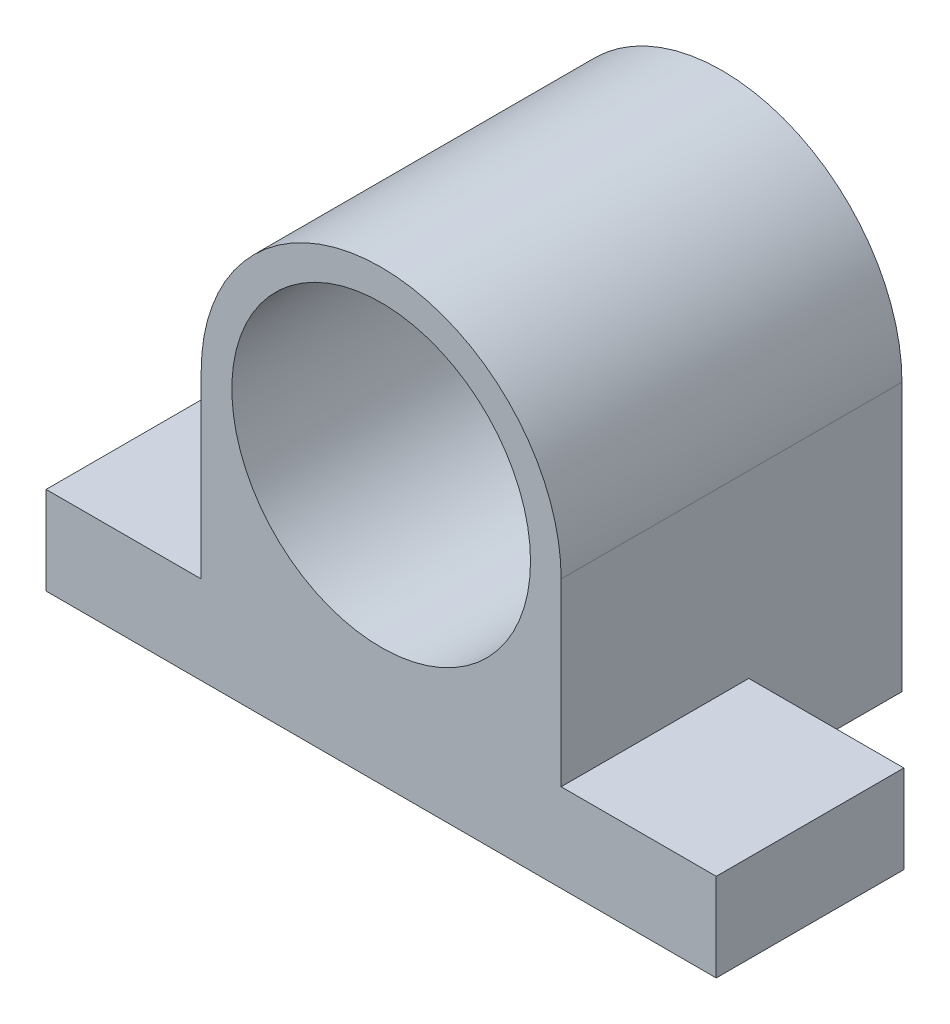
ISO-10303-21;
HEADER;
FILE_DESCRIPTION(('STEP AP214'),'2;1');
FILE_NAME('part.step','',(''),(''),'','','');
FILE_SCHEMA(('AUTOMOTIVE_DESIGN { 1 0 10303 214 1 1 1 1 }'));
ENDSEC;
DATA;
#1=APPLICATION_CONTEXT('core data for automotive mechanical design processes');
#2=APPLICATION_PROTOCOL_DEFINITION('international standard','automotive_design',2000,#1);
#3=PRODUCT_CONTEXT('',#1,'mechanical');
#4=PRODUCT('Part','Part','',(#3));
#5=PRODUCT_RELATED_PRODUCT_CATEGORY('part','',(#4));
#6=PRODUCT_DEFINITION_FORMATION('','',#4);
#7=PRODUCT_DEFINITION_CONTEXT('part definition',#1,'design');
#8=PRODUCT_DEFINITION('design','',#6,#7);
#9=PRODUCT_DEFINITION_SHAPE('','',#8);
#10=(LENGTH_UNIT() NAMED_UNIT(*) SI_UNIT(.MILLI.,.METRE.));
#11=(NAMED_UNIT(*) PLANE_ANGLE_UNIT() SI_UNIT($,.RADIAN.));
#12=(NAMED_UNIT(*) SI_UNIT($,.STERADIAN.) SOLID_ANGLE_UNIT());
#13=UNCERTAINTY_MEASURE_WITH_UNIT(LENGTH_MEASURE(1.E-05),#10,'distance_accuracy_value','');
#14=(GEOMETRIC_REPRESENTATION_CONTEXT(3) GLOBAL_UNCERTAINTY_ASSIGNED_CONTEXT((#13)) GLOBAL_UNIT_ASSIGNED_CONTEXT((#10,
#11,#12)) REPRESENTATION_CONTEXT('',''));
#15=CARTESIAN_POINT('',(0.,0.,0.));
#16=DIRECTION('',(0.,0.,1.));
#17=DIRECTION('',(1.,0.,0.));
#18=AXIS2_PLACEMENT_3D('',#15,#16,#17);
#19=CARTESIAN_POINT('',(0.,0.,0.));
#20=DIRECTION('',(0.,0.,1.));
#21=DIRECTION('',(1.,0.,0.));
#22=AXIS2_PLACEMENT_3D('',#19,#20,#21);
#23=PLANE('',#22);
#24=DIRECTION('',(0.,1.,0.));
#25=VECTOR('',#24,1.);
#26=CARTESIAN_POINT('',(11.938,0.,0.));
#27=LINE('',#26,#25);
#28=CARTESIAN_POINT('',(11.938,-17.78,0.));
#29=VERTEX_POINT('',#28);
#30=CARTESIAN_POINT('',(11.938,0.,0.));
#31=VERTEX_POINT('',#30);
#32=EDGE_CURVE('E62',#29,#31,#27,.T.);
#33=ORIENTED_EDGE('',*,*,#32,.F.);
#34=DIRECTION('',(1.,0.,0.));
#35=VECTOR('',#34,1.);
#36=CARTESIAN_POINT('',(22.225,-17.78,0.));
#37=LINE('',#36,#35);
#38=CARTESIAN_POINT('',(-11.938,-17.78,0.));
#39=VERTEX_POINT('',#38);
#40=EDGE_CURVE('E255',#39,#29,#37,.T.);
#41=ORIENTED_EDGE('',*,*,#40,.F.);
#42=DIRECTION('',(0.,-1.,0.));
#43=VECTOR('',#42,1.);
#44=CARTESIAN_POINT('',(-11.938,-11.938,0.));
#45=LINE('',#44,#43);
#46=CARTESIAN_POINT('',(-11.938,0.,0.));
#47=VERTEX_POINT('',#46);
#48=EDGE_CURVE('E252',#47,#39,#45,.T.);
#49=ORIENTED_EDGE('',*,*,#48,.F.);
#50=CARTESIAN_POINT('',(0.,0.,0.));
#51=DIRECTION('',(0.,0.,1.));
#52=DIRECTION('',(1.,0.,0.));
#53=AXIS2_PLACEMENT_3D('',#50,#51,#52);
#54=CIRCLE('',#53,11.938);
#55=EDGE_CURVE('E248',#31,#47,#54,.T.);
#56=ORIENTED_EDGE('',*,*,#55,.F.);
#57=EDGE_LOOP('',(#33,#41,#49,#56));
#58=FACE_BOUND('',#57,.T.);
#59=CARTESIAN_POINT('',(0.,0.,0.));
#60=DIRECTION('',(0.,0.,1.));
#61=DIRECTION('',(1.,0.,0.));
#62=AXIS2_PLACEMENT_3D('',#59,#60,#61);
#63=CIRCLE('',#62,8.763);
#64=CARTESIAN_POINT('',(8.763,0.,0.));
#65=VERTEX_POINT('',#64);
#66=EDGE_CURVE('E244',#65,#65,#63,.T.);
#67=ORIENTED_EDGE('',*,*,#66,.T.);
#68=EDGE_LOOP('',(#67));
#69=FACE_BOUND('',#68,.T.);
#70=ADVANCED_FACE('F38',(#58,#69),#23,.F.);
#71=CARTESIAN_POINT('',(0.,0.,3.556));
#72=DIRECTION('',(0.,0.,-1.));
#73=DIRECTION('',(-1.,0.,0.));
#74=AXIS2_PLACEMENT_3D('',#71,#72,#73);
#75=CYLINDRICAL_SURFACE('',#74,11.938);
#76=ORIENTED_EDGE('',*,*,#55,.T.);
#77=DIRECTION('',(0.,0.,-1.));
#78=VECTOR('',#77,1.);
#79=CARTESIAN_POINT('',(-11.938,0.,3.556));
#80=LINE('',#79,#78);
#81=CARTESIAN_POINT('',(-11.938,0.,22.606));
#82=VERTEX_POINT('',#81);
#83=EDGE_CURVE('E165',#82,#47,#80,.T.);
#84=ORIENTED_EDGE('',*,*,#83,.F.);
#85=CARTESIAN_POINT('',(0.,0.,22.606));
#86=DIRECTION('',(0.,0.,1.));
#87=DIRECTION('',(1.,0.,0.));
#88=AXIS2_PLACEMENT_3D('',#85,#86,#87);
#89=CIRCLE('',#88,11.938);
#90=CARTESIAN_POINT('',(11.938,0.,22.606));
#91=VERTEX_POINT('',#90);
#92=EDGE_CURVE('E209',#91,#82,#89,.T.);
#93=ORIENTED_EDGE('',*,*,#92,.F.);
#94=DIRECTION('',(0.,0.,-1.));
#95=VECTOR('',#94,1.);
#96=CARTESIAN_POINT('',(11.938,0.,3.556));
#97=LINE('',#96,#95);
#98=EDGE_CURVE('E141',#91,#31,#97,.T.);
#99=ORIENTED_EDGE('',*,*,#98,.T.);
#100=EDGE_LOOP('',(#76,#84,#93,#99));
#101=FACE_BOUND('',#100,.T.);
#102=ADVANCED_FACE('F40',(#101),#75,.T.);
#103=CARTESIAN_POINT('',(-11.938,-11.938,3.556));
#104=DIRECTION('',(1.,0.,0.));
#105=DIRECTION('',(0.,0.,-1.));
#106=AXIS2_PLACEMENT_3D('',#103,#104,#105);
#107=PLANE('',#106);
#108=ORIENTED_EDGE('',*,*,#48,.T.);
#109=DIRECTION('',(0.,0.,-1.));
#110=VECTOR('',#109,1.);
#111=CARTESIAN_POINT('',(-11.938,-17.78,3.556));
#112=LINE('',#111,#110);
#113=CARTESIAN_POINT('',(-11.938,-17.78,10.16));
#114=VERTEX_POINT('',#113);
#115=EDGE_CURVE('E11',#114,#39,#112,.T.);
#116=ORIENTED_EDGE('',*,*,#115,.F.);
#117=DIRECTION('',(0.,1.,0.));
#118=VECTOR('',#117,1.);
#119=CARTESIAN_POINT('',(-11.938,-24.638,10.16));
#120=LINE('',#119,#118);
#121=CARTESIAN_POINT('',(-11.938,-11.938,10.16));
#122=VERTEX_POINT('',#121);
#123=EDGE_CURVE('E54',#114,#122,#120,.T.);
#124=ORIENTED_EDGE('',*,*,#123,.T.);
#125=DIRECTION('',(0.,0.,-1.));
#126=VECTOR('',#125,1.);
#127=CARTESIAN_POINT('',(-11.938,-11.938,3.556));
#128=LINE('',#127,#126);
#129=CARTESIAN_POINT('',(-11.938,-11.938,22.606));
#130=VERTEX_POINT('',#129);
#131=EDGE_CURVE('E161',#130,#122,#128,.T.);
#132=ORIENTED_EDGE('',*,*,#131,.F.);
#133=DIRECTION('',(0.,-1.,0.));
#134=VECTOR('',#133,1.);
#135=CARTESIAN_POINT('',(-11.938,0.,22.606));
#136=LINE('',#135,#134);
#137=EDGE_CURVE('E216',#82,#130,#136,.T.);
#138=ORIENTED_EDGE('',*,*,#137,.F.);
#139=ORIENTED_EDGE('',*,*,#83,.T.);
#140=EDGE_LOOP('',(#108,#116,#124,#132,#138,#139));
#141=FACE_BOUND('',#140,.T.);
#142=ADVANCED_FACE('F275',(#141),#107,.F.);
#143=CARTESIAN_POINT('',(-22.225,-11.938,3.556));
#144=DIRECTION('',(0.,-1.,0.));
#145=DIRECTION('',(0.,0.,-1.));
#146=AXIS2_PLACEMENT_3D('',#143,#144,#145);
#147=PLANE('',#146);
#148=ORIENTED_EDGE('',*,*,#131,.T.);
#149=DIRECTION('',(1.,0.,0.));
#150=VECTOR('',#149,1.);
#151=CARTESIAN_POINT('',(-22.225,-11.938,10.16));
#152=LINE('',#151,#150);
#153=CARTESIAN_POINT('',(-22.225,-11.938,10.16));
#154=VERTEX_POINT('',#153);
#155=EDGE_CURVE('E190',#154,#122,#152,.T.);
#156=ORIENTED_EDGE('',*,*,#155,.F.);
#157=DIRECTION('',(0.,0.,-1.));
#158=VECTOR('',#157,1.);
#159=CARTESIAN_POINT('',(-22.225,-11.938,3.556));
#160=LINE('',#159,#158);
#161=CARTESIAN_POINT('',(-22.225,-11.938,22.606));
#162=VERTEX_POINT('',#161);
#163=EDGE_CURVE('E157',#162,#154,#160,.T.);
#164=ORIENTED_EDGE('',*,*,#163,.F.);
#165=DIRECTION('',(-1.,0.,0.));
#166=VECTOR('',#165,1.);
#167=CARTESIAN_POINT('',(-11.938,-11.938,22.606));
#168=LINE('',#167,#166);
#169=EDGE_CURVE('E220',#130,#162,#168,.T.);
#170=ORIENTED_EDGE('',*,*,#169,.F.);
#171=EDGE_LOOP('',(#148,#156,#164,#170));
#172=FACE_BOUND('',#171,.T.);
#173=ADVANCED_FACE('F273',(#172),#147,.F.);
#174=CARTESIAN_POINT('',(-22.225,-17.78,3.556));
#175=DIRECTION('',(1.,0.,0.));
#176=DIRECTION('',(0.,0.,-1.));
#177=AXIS2_PLACEMENT_3D('',#174,#175,#176);
#178=PLANE('',#177);
#179=ORIENTED_EDGE('',*,*,#163,.T.);
#180=DIRECTION('',(0.,1.,0.));
#181=VECTOR('',#180,1.);
#182=CARTESIAN_POINT('',(-22.225,-24.638,10.16));
#183=LINE('',#182,#181);
#184=CARTESIAN_POINT('',(-22.225,-17.78,10.16));
#185=VERTEX_POINT('',#184);
#186=EDGE_CURVE('E183',#185,#154,#183,.T.);
#187=ORIENTED_EDGE('',*,*,#186,.F.);
#188=DIRECTION('',(0.,0.,-1.));
#189=VECTOR('',#188,1.);
#190=CARTESIAN_POINT('',(-22.225,-17.78,3.556));
#191=LINE('',#190,#189);
#192=CARTESIAN_POINT('',(-22.225,-17.78,22.606));
#193=VERTEX_POINT('',#192);
#194=EDGE_CURVE('E153',#193,#185,#191,.T.);
#195=ORIENTED_EDGE('',*,*,#194,.F.);
#196=DIRECTION('',(0.,-1.,0.));
#197=VECTOR('',#196,1.);
#198=CARTESIAN_POINT('',(-22.225,-11.938,22.606));
#199=LINE('',#198,#197);
#200=EDGE_CURVE('E224',#162,#193,#199,.T.);
#201=ORIENTED_EDGE('',*,*,#200,.F.);
#202=EDGE_LOOP('',(#179,#187,#195,#201));
#203=FACE_BOUND('',#202,.T.);
#204=ADVANCED_FACE('F186',(#203),#178,.F.);
#205=CARTESIAN_POINT('',(22.225,-17.78,3.556));
#206=DIRECTION('',(0.,1.,0.));
#207=DIRECTION('',(-1.,0.,0.));
#208=AXIS2_PLACEMENT_3D('',#205,#206,#207);
#209=PLANE('',#208);
#210=ORIENTED_EDGE('',*,*,#40,.T.);
#211=DIRECTION('',(0.,0.,1.));
#212=VECTOR('',#211,1.);
#213=CARTESIAN_POINT('',(11.938,-17.78,3.556));
#214=LINE('',#213,#212);
#215=CARTESIAN_POINT('',(11.938,-17.78,10.16));
#216=VERTEX_POINT('',#215);
#217=EDGE_CURVE('E199',#29,#216,#214,.T.);
#218=ORIENTED_EDGE('',*,*,#217,.T.);
#219=DIRECTION('',(1.,0.,0.));
#220=VECTOR('',#219,1.);
#221=CARTESIAN_POINT('',(22.225,-17.78,10.16));
#222=LINE('',#221,#220);
#223=CARTESIAN_POINT('',(22.225,-17.78,10.16));
#224=VERTEX_POINT('',#223);
#225=EDGE_CURVE('E121',#216,#224,#222,.T.);
#226=ORIENTED_EDGE('',*,*,#225,.T.);
#227=DIRECTION('',(0.,0.,-1.));
#228=VECTOR('',#227,1.);
#229=CARTESIAN_POINT('',(22.225,-17.78,3.556));
#230=LINE('',#229,#228);
#231=CARTESIAN_POINT('',(22.225,-17.78,22.606));
#232=VERTEX_POINT('',#231);
#233=EDGE_CURVE('E145',#232,#224,#230,.T.);
#234=ORIENTED_EDGE('',*,*,#233,.F.);
#235=DIRECTION('',(1.,0.,0.));
#236=VECTOR('',#235,1.);
#237=CARTESIAN_POINT('',(-22.225,-17.78,22.606));
#238=LINE('',#237,#236);
#239=EDGE_CURVE('E227',#193,#232,#238,.T.);
#240=ORIENTED_EDGE('',*,*,#239,.F.);
#241=ORIENTED_EDGE('',*,*,#194,.T.);
#242=DIRECTION('',(1.,0.,0.));
#243=VECTOR('',#242,1.);
#244=CARTESIAN_POINT('',(22.225,-17.78,10.16));
#245=LINE('',#244,#243);
#246=EDGE_CURVE('E47',#185,#114,#245,.T.);
#247=ORIENTED_EDGE('',*,*,#246,.T.);
#248=ORIENTED_EDGE('',*,*,#115,.T.);
#249=EDGE_LOOP('',(#210,#218,#226,#234,#240,#241,#247,#248));
#250=FACE_BOUND('',#249,.T.);
#251=ADVANCED_FACE('F178',(#250),#209,.F.);
#252=CARTESIAN_POINT('',(22.225,-11.938,3.556));
#253=DIRECTION('',(-1.,0.,0.));
#254=DIRECTION('',(0.,-1.,0.));
#255=AXIS2_PLACEMENT_3D('',#252,#253,#254);
#256=PLANE('',#255);
#257=ORIENTED_EDGE('',*,*,#233,.T.);
#258=DIRECTION('',(0.,1.,0.));
#259=VECTOR('',#258,1.);
#260=CARTESIAN_POINT('',(22.225,-24.638,10.16));
#261=LINE('',#260,#259);
#262=CARTESIAN_POINT('',(22.225,-11.938,10.16));
#263=VERTEX_POINT('',#262);
#264=EDGE_CURVE('E125',#224,#263,#261,.T.);
#265=ORIENTED_EDGE('',*,*,#264,.T.);
#266=DIRECTION('',(0.,0.,-1.));
#267=VECTOR('',#266,1.);
#268=CARTESIAN_POINT('',(22.225,-11.938,3.556));
#269=LINE('',#268,#267);
#270=CARTESIAN_POINT('',(22.225,-11.938,22.606));
#271=VERTEX_POINT('',#270);
#272=EDGE_CURVE('E133',#271,#263,#269,.T.);
#273=ORIENTED_EDGE('',*,*,#272,.F.);
#274=DIRECTION('',(0.,1.,0.));
#275=VECTOR('',#274,1.);
#276=CARTESIAN_POINT('',(22.225,-17.78,22.606));
#277=LINE('',#276,#275);
#278=EDGE_CURVE('E231',#232,#271,#277,.T.);
#279=ORIENTED_EDGE('',*,*,#278,.F.);
#280=EDGE_LOOP('',(#257,#265,#273,#279));
#281=FACE_BOUND('',#280,.T.);
#282=ADVANCED_FACE('F261',(#281),#256,.F.);
#283=CARTESIAN_POINT('',(11.938,-11.938,3.556));
#284=DIRECTION('',(0.,-1.,0.));
#285=DIRECTION('',(1.,0.,0.));
#286=AXIS2_PLACEMENT_3D('',#283,#284,#285);
#287=PLANE('',#286);
#288=ORIENTED_EDGE('',*,*,#272,.T.);
#289=DIRECTION('',(1.,0.,0.));
#290=VECTOR('',#289,1.);
#291=CARTESIAN_POINT('',(11.938,-11.938,10.16));
#292=LINE('',#291,#290);
#293=CARTESIAN_POINT('',(11.938,-11.938,10.16));
#294=VERTEX_POINT('',#293);
#295=EDGE_CURVE('E118',#294,#263,#292,.T.);
#296=ORIENTED_EDGE('',*,*,#295,.F.);
#297=DIRECTION('',(0.,0.,-1.));
#298=VECTOR('',#297,1.);
#299=CARTESIAN_POINT('',(11.938,-11.938,3.556));
#300=LINE('',#299,#298);
#301=CARTESIAN_POINT('',(11.938,-11.938,22.606));
#302=VERTEX_POINT('',#301);
#303=EDGE_CURVE('E131',#302,#294,#300,.T.);
#304=ORIENTED_EDGE('',*,*,#303,.F.);
#305=DIRECTION('',(-1.,0.,0.));
#306=VECTOR('',#305,1.);
#307=CARTESIAN_POINT('',(22.225,-11.938,22.606));
#308=LINE('',#307,#306);
#309=EDGE_CURVE('E235',#271,#302,#308,.T.);
#310=ORIENTED_EDGE('',*,*,#309,.F.);
#311=EDGE_LOOP('',(#288,#296,#304,#310));
#312=FACE_BOUND('',#311,.T.);
#313=ADVANCED_FACE('F129',(#312),#287,.F.);
#314=CARTESIAN_POINT('',(11.938,0.,3.556));
#315=DIRECTION('',(-1.,0.,0.));
#316=DIRECTION('',(0.,-1.,0.));
#317=AXIS2_PLACEMENT_3D('',#314,#315,#316);
#318=PLANE('',#317);
#319=ORIENTED_EDGE('',*,*,#32,.T.);
#320=ORIENTED_EDGE('',*,*,#98,.F.);
#321=DIRECTION('',(0.,1.,0.));
#322=VECTOR('',#321,1.);
#323=CARTESIAN_POINT('',(11.938,-11.938,22.606));
#324=LINE('',#323,#322);
#325=EDGE_CURVE('E139',#302,#91,#324,.T.);
#326=ORIENTED_EDGE('',*,*,#325,.F.);
#327=ORIENTED_EDGE('',*,*,#303,.T.);
#328=DIRECTION('',(0.,1.,0.));
#329=VECTOR('',#328,1.);
#330=CARTESIAN_POINT('',(11.938,-24.638,10.16));
#331=LINE('',#330,#329);
#332=EDGE_CURVE('E115',#216,#294,#331,.T.);
#333=ORIENTED_EDGE('',*,*,#332,.F.);
#334=ORIENTED_EDGE('',*,*,#217,.F.);
#335=EDGE_LOOP('',(#319,#320,#326,#327,#333,#334));
#336=FACE_BOUND('',#335,.T.);
#337=ADVANCED_FACE('F137',(#336),#318,.F.);
#338=CARTESIAN_POINT('',(0.,0.,3.556));
#339=DIRECTION('',(0.,0.,-1.));
#340=DIRECTION('',(-1.,0.,0.));
#341=AXIS2_PLACEMENT_3D('',#338,#339,#340);
#342=CYLINDRICAL_SURFACE('',#341,8.763);
#343=CARTESIAN_POINT('',(0.,0.,3.556));
#344=DIRECTION('',(0.,0.,1.));
#345=DIRECTION('',(1.,0.,0.));
#346=AXIS2_PLACEMENT_3D('',#343,#344,#345);
#347=CIRCLE('',#346,8.763);
#348=CARTESIAN_POINT('',(8.763,0.,3.556));
#349=VERTEX_POINT('',#348);
#350=EDGE_CURVE('E240',#349,#349,#347,.T.);
#351=ORIENTED_EDGE('',*,*,#350,.T.);
#352=EDGE_LOOP('',(#351));
#353=FACE_BOUND('',#352,.T.);
#354=ORIENTED_EDGE('',*,*,#66,.F.);
#355=EDGE_LOOP('',(#354));
#356=FACE_BOUND('',#355,.T.);
#357=ADVANCED_FACE('F288',(#353,#356),#342,.F.);
#358=CARTESIAN_POINT('',(0.,0.,3.556));
#359=DIRECTION('',(0.,0.,1.));
#360=DIRECTION('',(1.,0.,0.));
#361=AXIS2_PLACEMENT_3D('',#358,#359,#360);
#362=PLANE('',#361);
#363=CARTESIAN_POINT('',(0.,0.,3.556));
#364=DIRECTION('',(0.,0.,1.));
#365=DIRECTION('',(1.,0.,0.));
#366=AXIS2_PLACEMENT_3D('',#363,#364,#365);
#367=CIRCLE('',#366,6.35);
#368=CARTESIAN_POINT('',(6.35,0.,3.556));
#369=VERTEX_POINT('',#368);
#370=EDGE_CURVE('E169',#369,#369,#367,.T.);
#371=ORIENTED_EDGE('',*,*,#370,.T.);
#372=EDGE_LOOP('',(#371));
#373=FACE_BOUND('',#372,.T.);
#374=ORIENTED_EDGE('',*,*,#350,.F.);
#375=EDGE_LOOP('',(#374));
#376=FACE_BOUND('',#375,.T.);
#377=ADVANCED_FACE('F326',(#373,#376),#362,.F.);
#378=CARTESIAN_POINT('',(0.,0.,22.606));
#379=DIRECTION('',(0.,0.,1.));
#380=DIRECTION('',(1.,0.,0.));
#381=AXIS2_PLACEMENT_3D('',#378,#379,#380);
#382=PLANE('',#381);
#383=CARTESIAN_POINT('',(0.,0.,22.606));
#384=DIRECTION('',(0.,0.,1.));
#385=DIRECTION('',(1.,0.,0.));
#386=AXIS2_PLACEMENT_3D('',#383,#384,#385);
#387=CIRCLE('',#386,9.906);
#388=CARTESIAN_POINT('',(9.906,0.,22.606));
#389=VERTEX_POINT('',#388);
#390=EDGE_CURVE('E172',#389,#389,#387,.T.);
#391=ORIENTED_EDGE('',*,*,#390,.F.);
#392=EDGE_LOOP('',(#391));
#393=FACE_BOUND('',#392,.T.);
#394=ORIENTED_EDGE('',*,*,#92,.T.);
#395=ORIENTED_EDGE('',*,*,#137,.T.);
#396=ORIENTED_EDGE('',*,*,#169,.T.);
#397=ORIENTED_EDGE('',*,*,#200,.T.);
#398=ORIENTED_EDGE('',*,*,#239,.T.);
#399=ORIENTED_EDGE('',*,*,#278,.T.);
#400=ORIENTED_EDGE('',*,*,#309,.T.);
#401=ORIENTED_EDGE('',*,*,#325,.T.);
#402=EDGE_LOOP('',(#394,#395,#396,#397,#398,#399,#400,#401));
#403=FACE_BOUND('',#402,.T.);
#404=ADVANCED_FACE('F270',(#393,#403),#382,.T.);
#405=CARTESIAN_POINT('',(0.,0.,4.826));
#406=DIRECTION('',(0.,0.,1.));
#407=DIRECTION('',(1.,0.,0.));
#408=AXIS2_PLACEMENT_3D('',#405,#406,#407);
#409=CYLINDRICAL_SURFACE('',#408,9.906);
#410=CARTESIAN_POINT('',(0.,0.,4.826));
#411=DIRECTION('',(0.,0.,1.));
#412=DIRECTION('',(1.,0.,0.));
#413=AXIS2_PLACEMENT_3D('',#410,#411,#412);
#414=CIRCLE('',#413,9.906);
#415=CARTESIAN_POINT('',(9.906,0.,4.826));
#416=VERTEX_POINT('',#415);
#417=EDGE_CURVE('E205',#416,#416,#414,.T.);
#418=ORIENTED_EDGE('',*,*,#417,.F.);
#419=EDGE_LOOP('',(#418));
#420=FACE_BOUND('',#419,.T.);
#421=ORIENTED_EDGE('',*,*,#390,.T.);
#422=EDGE_LOOP('',(#421));
#423=FACE_BOUND('',#422,.T.);
#424=ADVANCED_FACE('F342',(#420,#423),#409,.F.);
#425=CARTESIAN_POINT('',(0.,0.,4.826));
#426=DIRECTION('',(0.,0.,1.));
#427=DIRECTION('',(1.,0.,0.));
#428=AXIS2_PLACEMENT_3D('',#425,#426,#427);
#429=PLANE('',#428);
#430=CARTESIAN_POINT('',(0.,0.,4.826));
#431=DIRECTION('',(0.,0.,1.));
#432=DIRECTION('',(1.,0.,0.));
#433=AXIS2_PLACEMENT_3D('',#430,#431,#432);
#434=CIRCLE('',#433,6.35);
#435=CARTESIAN_POINT('',(6.35,0.,4.826));
#436=VERTEX_POINT('',#435);
#437=EDGE_CURVE('E173',#436,#436,#434,.T.);
#438=ORIENTED_EDGE('',*,*,#437,.F.);
#439=EDGE_LOOP('',(#438));
#440=FACE_BOUND('',#439,.T.);
#441=ORIENTED_EDGE('',*,*,#417,.T.);
#442=EDGE_LOOP('',(#441));
#443=FACE_BOUND('',#442,.T.);
#444=ADVANCED_FACE('F349',(#440,#443),#429,.T.);
#445=CARTESIAN_POINT('',(0.,0.,-12.954));
#446=DIRECTION('',(0.,0.,1.));
#447=DIRECTION('',(1.,0.,0.));
#448=AXIS2_PLACEMENT_3D('',#445,#446,#447);
#449=CYLINDRICAL_SURFACE('',#448,6.35);
#450=ORIENTED_EDGE('',*,*,#437,.T.);
#451=EDGE_LOOP('',(#450));
#452=FACE_BOUND('',#451,.T.);
#453=ORIENTED_EDGE('',*,*,#370,.F.);
#454=EDGE_LOOP('',(#453));
#455=FACE_BOUND('',#454,.T.);
#456=ADVANCED_FACE('F356',(#452,#455),#449,.F.);
#457=CARTESIAN_POINT('',(11.938,-24.638,10.16));
#458=DIRECTION('',(0.,0.,1.));
#459=DIRECTION('',(1.,0.,0.));
#460=AXIS2_PLACEMENT_3D('',#457,#458,#459);
#461=PLANE('',#460);
#462=ORIENTED_EDGE('',*,*,#332,.T.);
#463=ORIENTED_EDGE('',*,*,#295,.T.);
#464=ORIENTED_EDGE('',*,*,#264,.F.);
#465=ORIENTED_EDGE('',*,*,#225,.F.);
#466=EDGE_LOOP('',(#462,#463,#464,#465));
#467=FACE_BOUND('',#466,.T.);
#468=ADVANCED_FACE('F117',(#467),#461,.F.);
#469=CARTESIAN_POINT('',(-22.225,-24.638,10.16));
#470=DIRECTION('',(0.,0.,1.));
#471=DIRECTION('',(1.,0.,0.));
#472=AXIS2_PLACEMENT_3D('',#469,#470,#471);
#473=PLANE('',#472);
#474=ORIENTED_EDGE('',*,*,#186,.T.);
#475=ORIENTED_EDGE('',*,*,#155,.T.);
#476=ORIENTED_EDGE('',*,*,#123,.F.);
#477=ORIENTED_EDGE('',*,*,#246,.F.);
#478=EDGE_LOOP('',(#474,#475,#476,#477));
#479=FACE_BOUND('',#478,.T.);
#480=ADVANCED_FACE('F182',(#479),#473,.F.);
#481=CLOSED_SHELL('',(#70,#102,#142,#173,#204,#251,#282,#313,#337,#357,#377,#404,#424,#444,#456,
#468,#480));
#482=MANIFOLD_SOLID_BREP('B2',#481);
#483=ADVANCED_BREP_SHAPE_REPRESENTATION('',(#18,#482),#14);
#484=SHAPE_DEFINITION_REPRESENTATION(#9,#483);
ENDSEC;
END-ISO-10303-21;
